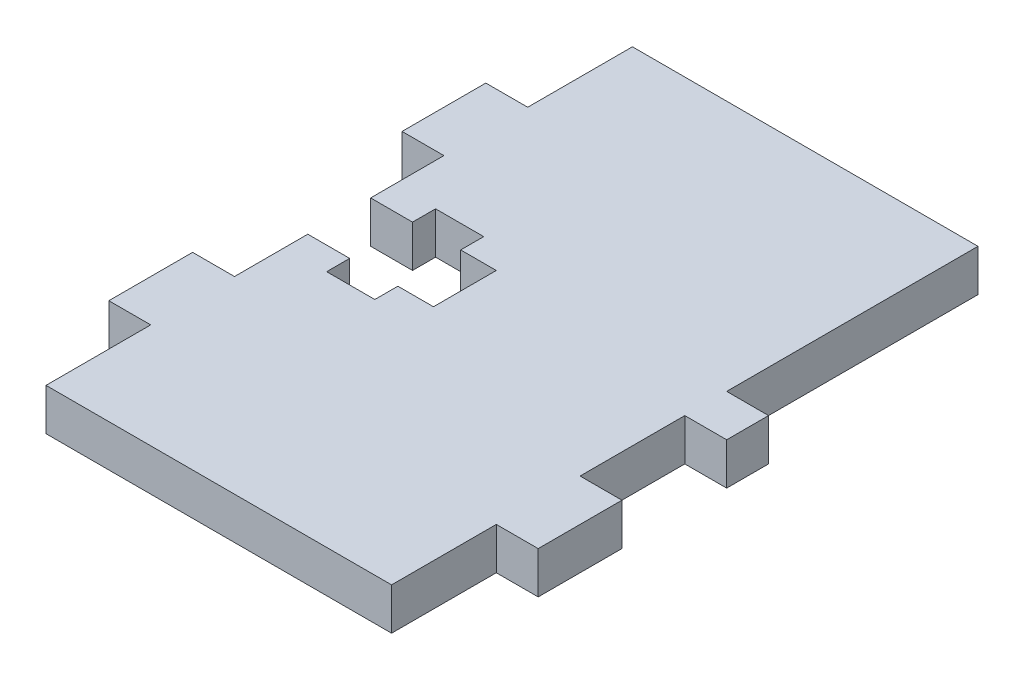
ISO-10303-21;
HEADER;
FILE_DESCRIPTION(('STEP AP214'),'2;1');
FILE_NAME('part.step','',(''),(''),'','','');
FILE_SCHEMA(('AUTOMOTIVE_DESIGN { 1 0 10303 214 1 1 1 1 }'));
ENDSEC;
DATA;
#1=APPLICATION_CONTEXT('core data for automotive mechanical design processes');
#2=APPLICATION_PROTOCOL_DEFINITION('international standard','automotive_design',2000,#1);
#3=PRODUCT_CONTEXT('',#1,'mechanical');
#4=PRODUCT('Part','Part','',(#3));
#5=PRODUCT_RELATED_PRODUCT_CATEGORY('part','',(#4));
#6=PRODUCT_DEFINITION_FORMATION('','',#4);
#7=PRODUCT_DEFINITION_CONTEXT('part definition',#1,'design');
#8=PRODUCT_DEFINITION('design','',#6,#7);
#9=PRODUCT_DEFINITION_SHAPE('','',#8);
#10=(LENGTH_UNIT() NAMED_UNIT(*) SI_UNIT(.MILLI.,.METRE.));
#11=(NAMED_UNIT(*) PLANE_ANGLE_UNIT() SI_UNIT($,.RADIAN.));
#12=(NAMED_UNIT(*) SI_UNIT($,.STERADIAN.) SOLID_ANGLE_UNIT());
#13=UNCERTAINTY_MEASURE_WITH_UNIT(LENGTH_MEASURE(1.E-05),#10,'distance_accuracy_value','');
#14=(GEOMETRIC_REPRESENTATION_CONTEXT(3) GLOBAL_UNCERTAINTY_ASSIGNED_CONTEXT((#13)) GLOBAL_UNIT_ASSIGNED_CONTEXT((#10,
#11,#12)) REPRESENTATION_CONTEXT('',''));
#15=CARTESIAN_POINT('',(0.,0.,0.));
#16=DIRECTION('',(0.,0.,1.));
#17=DIRECTION('',(1.,0.,0.));
#18=AXIS2_PLACEMENT_3D('',#15,#16,#17);
#19=CARTESIAN_POINT('',(0.,2.,0.));
#20=DIRECTION('',(1.,0.,0.));
#21=DIRECTION('',(0.,0.,-1.));
#22=AXIS2_PLACEMENT_3D('',#19,#20,#21);
#23=PLANE('',#22);
#24=DIRECTION('',(0.,0.,1.));
#25=VECTOR('',#24,1.);
#26=CARTESIAN_POINT('',(0.,0.,0.));
#27=LINE('',#26,#25);
#28=CARTESIAN_POINT('',(0.,0.,-5.));
#29=VERTEX_POINT('',#28);
#30=CARTESIAN_POINT('',(0.,0.,0.));
#31=VERTEX_POINT('',#30);
#32=EDGE_CURVE('E273',#29,#31,#27,.T.);
#33=ORIENTED_EDGE('',*,*,#32,.T.);
#34=DIRECTION('',(0.,-1.,0.));
#35=VECTOR('',#34,1.);
#36=CARTESIAN_POINT('',(0.,2.,0.));
#37=LINE('',#36,#35);
#38=CARTESIAN_POINT('',(0.,2.,0.));
#39=VERTEX_POINT('',#38);
#40=EDGE_CURVE('E11',#39,#31,#37,.T.);
#41=ORIENTED_EDGE('',*,*,#40,.F.);
#42=DIRECTION('',(0.,0.,1.));
#43=VECTOR('',#42,1.);
#44=CARTESIAN_POINT('',(0.,2.,0.));
#45=LINE('',#44,#43);
#46=CARTESIAN_POINT('',(0.,2.,-5.));
#47=VERTEX_POINT('',#46);
#48=EDGE_CURVE('E335',#47,#39,#45,.T.);
#49=ORIENTED_EDGE('',*,*,#48,.F.);
#50=DIRECTION('',(0.,-1.,0.));
#51=VECTOR('',#50,1.);
#52=CARTESIAN_POINT('',(0.,2.,-5.));
#53=LINE('',#52,#51);
#54=EDGE_CURVE('E269',#47,#29,#53,.T.);
#55=ORIENTED_EDGE('',*,*,#54,.T.);
#56=EDGE_LOOP('',(#33,#41,#49,#55));
#57=FACE_BOUND('',#56,.T.);
#58=ADVANCED_FACE('F33',(#57),#23,.F.);
#59=CARTESIAN_POINT('',(0.,2.,0.));
#60=DIRECTION('',(0.,0.,-1.));
#61=DIRECTION('',(-1.,0.,0.));
#62=AXIS2_PLACEMENT_3D('',#59,#60,#61);
#63=PLANE('',#62);
#64=DIRECTION('',(1.,0.,0.));
#65=VECTOR('',#64,1.);
#66=CARTESIAN_POINT('',(0.,0.,0.));
#67=LINE('',#66,#65);
#68=CARTESIAN_POINT('',(16.5,0.,0.));
#69=VERTEX_POINT('',#68);
#70=EDGE_CURVE('E276',#31,#69,#67,.T.);
#71=ORIENTED_EDGE('',*,*,#70,.T.);
#72=DIRECTION('',(0.,-1.,0.));
#73=VECTOR('',#72,1.);
#74=CARTESIAN_POINT('',(16.5,2.,0.));
#75=LINE('',#74,#73);
#76=CARTESIAN_POINT('',(16.5,2.,0.));
#77=VERTEX_POINT('',#76);
#78=EDGE_CURVE('E41',#77,#69,#75,.T.);
#79=ORIENTED_EDGE('',*,*,#78,.F.);
#80=DIRECTION('',(1.,0.,0.));
#81=VECTOR('',#80,1.);
#82=CARTESIAN_POINT('',(0.,2.,0.));
#83=LINE('',#82,#81);
#84=EDGE_CURVE('E164',#39,#77,#83,.T.);
#85=ORIENTED_EDGE('',*,*,#84,.F.);
#86=ORIENTED_EDGE('',*,*,#40,.T.);
#87=EDGE_LOOP('',(#71,#79,#85,#86));
#88=FACE_BOUND('',#87,.T.);
#89=ADVANCED_FACE('F513',(#88),#63,.F.);
#90=CARTESIAN_POINT('',(16.5,2.,0.));
#91=DIRECTION('',(-1.,0.,0.));
#92=DIRECTION('',(0.,0.,1.));
#93=AXIS2_PLACEMENT_3D('',#90,#91,#92);
#94=PLANE('',#93);
#95=DIRECTION('',(0.,0.,-1.));
#96=VECTOR('',#95,1.);
#97=CARTESIAN_POINT('',(16.5,0.,0.));
#98=LINE('',#97,#96);
#99=CARTESIAN_POINT('',(16.5,0.,-5.));
#100=VERTEX_POINT('',#99);
#101=EDGE_CURVE('E278',#69,#100,#98,.T.);
#102=ORIENTED_EDGE('',*,*,#101,.T.);
#103=DIRECTION('',(0.,-1.,0.));
#104=VECTOR('',#103,1.);
#105=CARTESIAN_POINT('',(16.5,2.,-5.));
#106=LINE('',#105,#104);
#107=CARTESIAN_POINT('',(16.5,2.,-5.));
#108=VERTEX_POINT('',#107);
#109=EDGE_CURVE('E414',#108,#100,#106,.T.);
#110=ORIENTED_EDGE('',*,*,#109,.F.);
#111=DIRECTION('',(0.,0.,-1.));
#112=VECTOR('',#111,1.);
#113=CARTESIAN_POINT('',(16.5,2.,0.));
#114=LINE('',#113,#112);
#115=EDGE_CURVE('E422',#77,#108,#114,.T.);
#116=ORIENTED_EDGE('',*,*,#115,.F.);
#117=ORIENTED_EDGE('',*,*,#78,.T.);
#118=EDGE_LOOP('',(#102,#110,#116,#117));
#119=FACE_BOUND('',#118,.T.);
#120=ADVANCED_FACE('F420',(#119),#94,.F.);
#121=CARTESIAN_POINT('',(16.5,2.,-5.));
#122=DIRECTION('',(0.,0.,-1.));
#123=DIRECTION('',(-1.,0.,0.));
#124=AXIS2_PLACEMENT_3D('',#121,#122,#123);
#125=PLANE('',#124);
#126=DIRECTION('',(1.,0.,0.));
#127=VECTOR('',#126,1.);
#128=CARTESIAN_POINT('',(16.5,0.,-5.));
#129=LINE('',#128,#127);
#130=CARTESIAN_POINT('',(18.5,0.,-5.));
#131=VERTEX_POINT('',#130);
#132=EDGE_CURVE('E280',#100,#131,#129,.T.);
#133=ORIENTED_EDGE('',*,*,#132,.T.);
#134=DIRECTION('',(0.,-1.,0.));
#135=VECTOR('',#134,1.);
#136=CARTESIAN_POINT('',(18.5,2.,-5.));
#137=LINE('',#136,#135);
#138=CARTESIAN_POINT('',(18.5,2.,-5.));
#139=VERTEX_POINT('',#138);
#140=EDGE_CURVE('E411',#139,#131,#137,.T.);
#141=ORIENTED_EDGE('',*,*,#140,.F.);
#142=DIRECTION('',(1.,0.,0.));
#143=VECTOR('',#142,1.);
#144=CARTESIAN_POINT('',(16.5,2.,-5.));
#145=LINE('',#144,#143);
#146=EDGE_CURVE('E440',#108,#139,#145,.T.);
#147=ORIENTED_EDGE('',*,*,#146,.F.);
#148=ORIENTED_EDGE('',*,*,#109,.T.);
#149=EDGE_LOOP('',(#133,#141,#147,#148));
#150=FACE_BOUND('',#149,.T.);
#151=ADVANCED_FACE('F431',(#150),#125,.F.);
#152=CARTESIAN_POINT('',(18.5,2.,-5.));
#153=DIRECTION('',(-1.,0.,0.));
#154=DIRECTION('',(0.,0.,1.));
#155=AXIS2_PLACEMENT_3D('',#152,#153,#154);
#156=PLANE('',#155);
#157=DIRECTION('',(0.,0.,-1.));
#158=VECTOR('',#157,1.);
#159=CARTESIAN_POINT('',(18.5,0.,-5.));
#160=LINE('',#159,#158);
#161=CARTESIAN_POINT('',(18.5,0.,-9.));
#162=VERTEX_POINT('',#161);
#163=EDGE_CURVE('E282',#131,#162,#160,.T.);
#164=ORIENTED_EDGE('',*,*,#163,.T.);
#165=DIRECTION('',(0.,-1.,0.));
#166=VECTOR('',#165,1.);
#167=CARTESIAN_POINT('',(18.5,2.,-9.));
#168=LINE('',#167,#166);
#169=CARTESIAN_POINT('',(18.5,2.,-9.));
#170=VERTEX_POINT('',#169);
#171=EDGE_CURVE('E408',#170,#162,#168,.T.);
#172=ORIENTED_EDGE('',*,*,#171,.F.);
#173=DIRECTION('',(0.,0.,-1.));
#174=VECTOR('',#173,1.);
#175=CARTESIAN_POINT('',(18.5,2.,-5.));
#176=LINE('',#175,#174);
#177=EDGE_CURVE('E437',#139,#170,#176,.T.);
#178=ORIENTED_EDGE('',*,*,#177,.F.);
#179=ORIENTED_EDGE('',*,*,#140,.T.);
#180=EDGE_LOOP('',(#164,#172,#178,#179));
#181=FACE_BOUND('',#180,.T.);
#182=ADVANCED_FACE('F435',(#181),#156,.F.);
#183=CARTESIAN_POINT('',(16.5,2.,-9.));
#184=DIRECTION('',(0.,0.,1.));
#185=DIRECTION('',(1.,0.,0.));
#186=AXIS2_PLACEMENT_3D('',#183,#184,#185);
#187=PLANE('',#186);
#188=DIRECTION('',(-1.,0.,0.));
#189=VECTOR('',#188,1.);
#190=CARTESIAN_POINT('',(16.5,0.,-9.));
#191=LINE('',#190,#189);
#192=CARTESIAN_POINT('',(16.5,0.,-9.));
#193=VERTEX_POINT('',#192);
#194=EDGE_CURVE('E284',#162,#193,#191,.T.);
#195=ORIENTED_EDGE('',*,*,#194,.T.);
#196=DIRECTION('',(0.,-1.,0.));
#197=VECTOR('',#196,1.);
#198=CARTESIAN_POINT('',(16.5,2.,-9.));
#199=LINE('',#198,#197);
#200=CARTESIAN_POINT('',(16.5,2.,-9.));
#201=VERTEX_POINT('',#200);
#202=EDGE_CURVE('E405',#201,#193,#199,.T.);
#203=ORIENTED_EDGE('',*,*,#202,.F.);
#204=DIRECTION('',(-1.,0.,0.));
#205=VECTOR('',#204,1.);
#206=CARTESIAN_POINT('',(16.5,2.,-9.));
#207=LINE('',#206,#205);
#208=EDGE_CURVE('E439',#170,#201,#207,.T.);
#209=ORIENTED_EDGE('',*,*,#208,.F.);
#210=ORIENTED_EDGE('',*,*,#171,.T.);
#211=EDGE_LOOP('',(#195,#203,#209,#210));
#212=FACE_BOUND('',#211,.T.);
#213=ADVANCED_FACE('F526',(#212),#187,.F.);
#214=CARTESIAN_POINT('',(16.5,2.,-9.));
#215=DIRECTION('',(-1.,0.,0.));
#216=DIRECTION('',(0.,0.,1.));
#217=AXIS2_PLACEMENT_3D('',#214,#215,#216);
#218=PLANE('',#217);
#219=DIRECTION('',(0.,0.,-1.));
#220=VECTOR('',#219,1.);
#221=CARTESIAN_POINT('',(16.5,0.,-9.));
#222=LINE('',#221,#220);
#223=CARTESIAN_POINT('',(16.5,0.,-14.));
#224=VERTEX_POINT('',#223);
#225=EDGE_CURVE('E286',#193,#224,#222,.T.);
#226=ORIENTED_EDGE('',*,*,#225,.T.);
#227=DIRECTION('',(0.,-1.,0.));
#228=VECTOR('',#227,1.);
#229=CARTESIAN_POINT('',(16.5,2.,-14.));
#230=LINE('',#229,#228);
#231=CARTESIAN_POINT('',(16.5,2.,-14.));
#232=VERTEX_POINT('',#231);
#233=EDGE_CURVE('E402',#232,#224,#230,.T.);
#234=ORIENTED_EDGE('',*,*,#233,.F.);
#235=DIRECTION('',(0.,0.,-1.));
#236=VECTOR('',#235,1.);
#237=CARTESIAN_POINT('',(16.5,2.,-9.));
#238=LINE('',#237,#236);
#239=EDGE_CURVE('E442',#201,#232,#238,.T.);
#240=ORIENTED_EDGE('',*,*,#239,.F.);
#241=ORIENTED_EDGE('',*,*,#202,.T.);
#242=EDGE_LOOP('',(#226,#234,#240,#241));
#243=FACE_BOUND('',#242,.T.);
#244=ADVANCED_FACE('F529',(#243),#218,.F.);
#245=CARTESIAN_POINT('',(16.5,2.,-14.));
#246=DIRECTION('',(0.,0.,-1.));
#247=DIRECTION('',(-1.,0.,0.));
#248=AXIS2_PLACEMENT_3D('',#245,#246,#247);
#249=PLANE('',#248);
#250=DIRECTION('',(1.,0.,0.));
#251=VECTOR('',#250,1.);
#252=CARTESIAN_POINT('',(16.5,0.,-14.));
#253=LINE('',#252,#251);
#254=CARTESIAN_POINT('',(18.5,0.,-14.));
#255=VERTEX_POINT('',#254);
#256=EDGE_CURVE('E288',#224,#255,#253,.T.);
#257=ORIENTED_EDGE('',*,*,#256,.T.);
#258=DIRECTION('',(0.,-1.,0.));
#259=VECTOR('',#258,1.);
#260=CARTESIAN_POINT('',(18.5,2.,-14.));
#261=LINE('',#260,#259);
#262=CARTESIAN_POINT('',(18.5,2.,-14.));
#263=VERTEX_POINT('',#262);
#264=EDGE_CURVE('E399',#263,#255,#261,.T.);
#265=ORIENTED_EDGE('',*,*,#264,.F.);
#266=DIRECTION('',(1.,0.,0.));
#267=VECTOR('',#266,1.);
#268=CARTESIAN_POINT('',(16.5,2.,-14.));
#269=LINE('',#268,#267);
#270=EDGE_CURVE('E448',#232,#263,#269,.T.);
#271=ORIENTED_EDGE('',*,*,#270,.F.);
#272=ORIENTED_EDGE('',*,*,#233,.T.);
#273=EDGE_LOOP('',(#257,#265,#271,#272));
#274=FACE_BOUND('',#273,.T.);
#275=ADVANCED_FACE('F533',(#274),#249,.F.);
#276=CARTESIAN_POINT('',(18.5,2.,-14.));
#277=DIRECTION('',(-1.,0.,0.));
#278=DIRECTION('',(0.,0.,1.));
#279=AXIS2_PLACEMENT_3D('',#276,#277,#278);
#280=PLANE('',#279);
#281=DIRECTION('',(0.,0.,-1.));
#282=VECTOR('',#281,1.);
#283=CARTESIAN_POINT('',(18.5,0.,-14.));
#284=LINE('',#283,#282);
#285=CARTESIAN_POINT('',(18.5,0.,-16.));
#286=VERTEX_POINT('',#285);
#287=EDGE_CURVE('E290',#255,#286,#284,.T.);
#288=ORIENTED_EDGE('',*,*,#287,.T.);
#289=DIRECTION('',(0.,-1.,0.));
#290=VECTOR('',#289,1.);
#291=CARTESIAN_POINT('',(18.5,2.,-16.));
#292=LINE('',#291,#290);
#293=CARTESIAN_POINT('',(18.5,2.,-16.));
#294=VERTEX_POINT('',#293);
#295=EDGE_CURVE('E396',#294,#286,#292,.T.);
#296=ORIENTED_EDGE('',*,*,#295,.F.);
#297=DIRECTION('',(0.,0.,-1.));
#298=VECTOR('',#297,1.);
#299=CARTESIAN_POINT('',(18.5,2.,-14.));
#300=LINE('',#299,#298);
#301=EDGE_CURVE('E450',#263,#294,#300,.T.);
#302=ORIENTED_EDGE('',*,*,#301,.F.);
#303=ORIENTED_EDGE('',*,*,#264,.T.);
#304=EDGE_LOOP('',(#288,#296,#302,#303));
#305=FACE_BOUND('',#304,.T.);
#306=ADVANCED_FACE('F537',(#305),#280,.F.);
#307=CARTESIAN_POINT('',(16.5,2.,-16.));
#308=DIRECTION('',(0.,0.,1.));
#309=DIRECTION('',(1.,0.,0.));
#310=AXIS2_PLACEMENT_3D('',#307,#308,#309);
#311=PLANE('',#310);
#312=DIRECTION('',(-1.,0.,0.));
#313=VECTOR('',#312,1.);
#314=CARTESIAN_POINT('',(16.5,0.,-16.));
#315=LINE('',#314,#313);
#316=CARTESIAN_POINT('',(16.5,0.,-16.));
#317=VERTEX_POINT('',#316);
#318=EDGE_CURVE('E292',#286,#317,#315,.T.);
#319=ORIENTED_EDGE('',*,*,#318,.T.);
#320=DIRECTION('',(0.,-1.,0.));
#321=VECTOR('',#320,1.);
#322=CARTESIAN_POINT('',(16.5,2.,-16.));
#323=LINE('',#322,#321);
#324=CARTESIAN_POINT('',(16.5,2.,-16.));
#325=VERTEX_POINT('',#324);
#326=EDGE_CURVE('E393',#325,#317,#323,.T.);
#327=ORIENTED_EDGE('',*,*,#326,.F.);
#328=DIRECTION('',(-1.,0.,0.));
#329=VECTOR('',#328,1.);
#330=CARTESIAN_POINT('',(16.5,2.,-16.));
#331=LINE('',#330,#329);
#332=EDGE_CURVE('E452',#294,#325,#331,.T.);
#333=ORIENTED_EDGE('',*,*,#332,.F.);
#334=ORIENTED_EDGE('',*,*,#295,.T.);
#335=EDGE_LOOP('',(#319,#327,#333,#334));
#336=FACE_BOUND('',#335,.T.);
#337=ADVANCED_FACE('F541',(#336),#311,.F.);
#338=CARTESIAN_POINT('',(16.5,2.,-16.));
#339=DIRECTION('',(-1.,0.,0.));
#340=DIRECTION('',(0.,0.,1.));
#341=AXIS2_PLACEMENT_3D('',#338,#339,#340);
#342=PLANE('',#341);
#343=DIRECTION('',(0.,0.,-1.));
#344=VECTOR('',#343,1.);
#345=CARTESIAN_POINT('',(16.5,0.,-16.));
#346=LINE('',#345,#344);
#347=CARTESIAN_POINT('',(16.5,0.,-28.));
#348=VERTEX_POINT('',#347);
#349=EDGE_CURVE('E294',#317,#348,#346,.T.);
#350=ORIENTED_EDGE('',*,*,#349,.T.);
#351=DIRECTION('',(0.,-1.,0.));
#352=VECTOR('',#351,1.);
#353=CARTESIAN_POINT('',(16.5,2.,-28.));
#354=LINE('',#353,#352);
#355=CARTESIAN_POINT('',(16.5,2.,-28.));
#356=VERTEX_POINT('',#355);
#357=EDGE_CURVE('E390',#356,#348,#354,.T.);
#358=ORIENTED_EDGE('',*,*,#357,.F.);
#359=DIRECTION('',(0.,0.,-1.));
#360=VECTOR('',#359,1.);
#361=CARTESIAN_POINT('',(16.5,2.,-16.));
#362=LINE('',#361,#360);
#363=EDGE_CURVE('E454',#325,#356,#362,.T.);
#364=ORIENTED_EDGE('',*,*,#363,.F.);
#365=ORIENTED_EDGE('',*,*,#326,.T.);
#366=EDGE_LOOP('',(#350,#358,#364,#365));
#367=FACE_BOUND('',#366,.T.);
#368=ADVANCED_FACE('F545',(#367),#342,.F.);
#369=CARTESIAN_POINT('',(0.,2.,-28.));
#370=DIRECTION('',(0.,0.,1.));
#371=DIRECTION('',(1.,0.,0.));
#372=AXIS2_PLACEMENT_3D('',#369,#370,#371);
#373=PLANE('',#372);
#374=DIRECTION('',(-1.,0.,0.));
#375=VECTOR('',#374,1.);
#376=CARTESIAN_POINT('',(0.,0.,-28.));
#377=LINE('',#376,#375);
#378=CARTESIAN_POINT('',(0.,0.,-28.));
#379=VERTEX_POINT('',#378);
#380=EDGE_CURVE('E296',#348,#379,#377,.T.);
#381=ORIENTED_EDGE('',*,*,#380,.T.);
#382=DIRECTION('',(0.,-1.,0.));
#383=VECTOR('',#382,1.);
#384=CARTESIAN_POINT('',(0.,2.,-28.));
#385=LINE('',#384,#383);
#386=CARTESIAN_POINT('',(0.,2.,-28.));
#387=VERTEX_POINT('',#386);
#388=EDGE_CURVE('E387',#387,#379,#385,.T.);
#389=ORIENTED_EDGE('',*,*,#388,.F.);
#390=DIRECTION('',(-1.,0.,0.));
#391=VECTOR('',#390,1.);
#392=CARTESIAN_POINT('',(0.,2.,-28.));
#393=LINE('',#392,#391);
#394=EDGE_CURVE('E456',#356,#387,#393,.T.);
#395=ORIENTED_EDGE('',*,*,#394,.F.);
#396=ORIENTED_EDGE('',*,*,#357,.T.);
#397=EDGE_LOOP('',(#381,#389,#395,#396));
#398=FACE_BOUND('',#397,.T.);
#399=ADVANCED_FACE('F549',(#398),#373,.F.);
#400=CARTESIAN_POINT('',(0.,2.,-23.));
#401=DIRECTION('',(1.,0.,0.));
#402=DIRECTION('',(0.,0.,-1.));
#403=AXIS2_PLACEMENT_3D('',#400,#401,#402);
#404=PLANE('',#403);
#405=DIRECTION('',(0.,0.,1.));
#406=VECTOR('',#405,1.);
#407=CARTESIAN_POINT('',(0.,0.,-23.));
#408=LINE('',#407,#406);
#409=CARTESIAN_POINT('',(0.,0.,-23.));
#410=VERTEX_POINT('',#409);
#411=EDGE_CURVE('E298',#379,#410,#408,.T.);
#412=ORIENTED_EDGE('',*,*,#411,.T.);
#413=DIRECTION('',(0.,-1.,0.));
#414=VECTOR('',#413,1.);
#415=CARTESIAN_POINT('',(0.,2.,-23.));
#416=LINE('',#415,#414);
#417=CARTESIAN_POINT('',(0.,2.,-23.));
#418=VERTEX_POINT('',#417);
#419=EDGE_CURVE('E384',#418,#410,#416,.T.);
#420=ORIENTED_EDGE('',*,*,#419,.F.);
#421=DIRECTION('',(0.,0.,1.));
#422=VECTOR('',#421,1.);
#423=CARTESIAN_POINT('',(0.,2.,-23.));
#424=LINE('',#423,#422);
#425=EDGE_CURVE('E458',#387,#418,#424,.T.);
#426=ORIENTED_EDGE('',*,*,#425,.F.);
#427=ORIENTED_EDGE('',*,*,#388,.T.);
#428=EDGE_LOOP('',(#412,#420,#426,#427));
#429=FACE_BOUND('',#428,.T.);
#430=ADVANCED_FACE('F553',(#429),#404,.F.);
#431=CARTESIAN_POINT('',(0.,2.,-23.));
#432=DIRECTION('',(0.,0.,1.));
#433=DIRECTION('',(1.,0.,0.));
#434=AXIS2_PLACEMENT_3D('',#431,#432,#433);
#435=PLANE('',#434);
#436=DIRECTION('',(-1.,0.,0.));
#437=VECTOR('',#436,1.);
#438=CARTESIAN_POINT('',(0.,0.,-23.));
#439=LINE('',#438,#437);
#440=CARTESIAN_POINT('',(-2.,0.,-23.));
#441=VERTEX_POINT('',#440);
#442=EDGE_CURVE('E300',#410,#441,#439,.T.);
#443=ORIENTED_EDGE('',*,*,#442,.T.);
#444=DIRECTION('',(0.,-1.,0.));
#445=VECTOR('',#444,1.);
#446=CARTESIAN_POINT('',(-2.,2.,-23.));
#447=LINE('',#446,#445);
#448=CARTESIAN_POINT('',(-2.,2.,-23.));
#449=VERTEX_POINT('',#448);
#450=EDGE_CURVE('E381',#449,#441,#447,.T.);
#451=ORIENTED_EDGE('',*,*,#450,.F.);
#452=DIRECTION('',(-1.,0.,0.));
#453=VECTOR('',#452,1.);
#454=CARTESIAN_POINT('',(0.,2.,-23.));
#455=LINE('',#454,#453);
#456=EDGE_CURVE('E460',#418,#449,#455,.T.);
#457=ORIENTED_EDGE('',*,*,#456,.F.);
#458=ORIENTED_EDGE('',*,*,#419,.T.);
#459=EDGE_LOOP('',(#443,#451,#457,#458));
#460=FACE_BOUND('',#459,.T.);
#461=ADVANCED_FACE('F557',(#460),#435,.F.);
#462=CARTESIAN_POINT('',(-2.,2.,-23.));
#463=DIRECTION('',(1.,0.,0.));
#464=DIRECTION('',(0.,0.,-1.));
#465=AXIS2_PLACEMENT_3D('',#462,#463,#464);
#466=PLANE('',#465);
#467=DIRECTION('',(0.,0.,1.));
#468=VECTOR('',#467,1.);
#469=CARTESIAN_POINT('',(-2.,0.,-23.));
#470=LINE('',#469,#468);
#471=CARTESIAN_POINT('',(-2.,0.,-19.));
#472=VERTEX_POINT('',#471);
#473=EDGE_CURVE('E302',#441,#472,#470,.T.);
#474=ORIENTED_EDGE('',*,*,#473,.T.);
#475=DIRECTION('',(0.,-1.,0.));
#476=VECTOR('',#475,1.);
#477=CARTESIAN_POINT('',(-2.,2.,-19.));
#478=LINE('',#477,#476);
#479=CARTESIAN_POINT('',(-2.,2.,-19.));
#480=VERTEX_POINT('',#479);
#481=EDGE_CURVE('E378',#480,#472,#478,.T.);
#482=ORIENTED_EDGE('',*,*,#481,.F.);
#483=DIRECTION('',(0.,0.,1.));
#484=VECTOR('',#483,1.);
#485=CARTESIAN_POINT('',(-2.,2.,-23.));
#486=LINE('',#485,#484);
#487=EDGE_CURVE('E462',#449,#480,#486,.T.);
#488=ORIENTED_EDGE('',*,*,#487,.F.);
#489=ORIENTED_EDGE('',*,*,#450,.T.);
#490=EDGE_LOOP('',(#474,#482,#488,#489));
#491=FACE_BOUND('',#490,.T.);
#492=ADVANCED_FACE('F561',(#491),#466,.F.);
#493=CARTESIAN_POINT('',(0.,2.,-19.));
#494=DIRECTION('',(0.,0.,-1.));
#495=DIRECTION('',(-1.,0.,0.));
#496=AXIS2_PLACEMENT_3D('',#493,#494,#495);
#497=PLANE('',#496);
#498=DIRECTION('',(1.,0.,0.));
#499=VECTOR('',#498,1.);
#500=CARTESIAN_POINT('',(0.,0.,-19.));
#501=LINE('',#500,#499);
#502=CARTESIAN_POINT('',(0.,0.,-19.));
#503=VERTEX_POINT('',#502);
#504=EDGE_CURVE('E304',#472,#503,#501,.T.);
#505=ORIENTED_EDGE('',*,*,#504,.T.);
#506=DIRECTION('',(0.,-1.,0.));
#507=VECTOR('',#506,1.);
#508=CARTESIAN_POINT('',(0.,2.,-19.));
#509=LINE('',#508,#507);
#510=CARTESIAN_POINT('',(0.,2.,-19.));
#511=VERTEX_POINT('',#510);
#512=EDGE_CURVE('E375',#511,#503,#509,.T.);
#513=ORIENTED_EDGE('',*,*,#512,.F.);
#514=DIRECTION('',(1.,0.,0.));
#515=VECTOR('',#514,1.);
#516=CARTESIAN_POINT('',(0.,2.,-19.));
#517=LINE('',#516,#515);
#518=EDGE_CURVE('E464',#480,#511,#517,.T.);
#519=ORIENTED_EDGE('',*,*,#518,.F.);
#520=ORIENTED_EDGE('',*,*,#481,.T.);
#521=EDGE_LOOP('',(#505,#513,#519,#520));
#522=FACE_BOUND('',#521,.T.);
#523=ADVANCED_FACE('F565',(#522),#497,.F.);
#524=CARTESIAN_POINT('',(0.,2.,-15.5));
#525=DIRECTION('',(1.,0.,0.));
#526=DIRECTION('',(0.,0.,-1.));
#527=AXIS2_PLACEMENT_3D('',#524,#525,#526);
#528=PLANE('',#527);
#529=DIRECTION('',(0.,0.,1.));
#530=VECTOR('',#529,1.);
#531=CARTESIAN_POINT('',(0.,0.,-15.5));
#532=LINE('',#531,#530);
#533=CARTESIAN_POINT('',(0.,0.,-15.5));
#534=VERTEX_POINT('',#533);
#535=EDGE_CURVE('E306',#503,#534,#532,.T.);
#536=ORIENTED_EDGE('',*,*,#535,.T.);
#537=DIRECTION('',(0.,-1.,0.));
#538=VECTOR('',#537,1.);
#539=CARTESIAN_POINT('',(0.,2.,-15.5));
#540=LINE('',#539,#538);
#541=CARTESIAN_POINT('',(0.,2.,-15.5));
#542=VERTEX_POINT('',#541);
#543=EDGE_CURVE('E372',#542,#534,#540,.T.);
#544=ORIENTED_EDGE('',*,*,#543,.F.);
#545=DIRECTION('',(0.,0.,1.));
#546=VECTOR('',#545,1.);
#547=CARTESIAN_POINT('',(0.,2.,-15.5));
#548=LINE('',#547,#546);
#549=EDGE_CURVE('E466',#511,#542,#548,.T.);
#550=ORIENTED_EDGE('',*,*,#549,.F.);
#551=ORIENTED_EDGE('',*,*,#512,.T.);
#552=EDGE_LOOP('',(#536,#544,#550,#551));
#553=FACE_BOUND('',#552,.T.);
#554=ADVANCED_FACE('F569',(#553),#528,.F.);
#555=CARTESIAN_POINT('',(2.,2.,-15.5));
#556=DIRECTION('',(0.,0.,-1.));
#557=DIRECTION('',(-1.,0.,0.));
#558=AXIS2_PLACEMENT_3D('',#555,#556,#557);
#559=PLANE('',#558);
#560=DIRECTION('',(1.,0.,0.));
#561=VECTOR('',#560,1.);
#562=CARTESIAN_POINT('',(2.,0.,-15.5));
#563=LINE('',#562,#561);
#564=CARTESIAN_POINT('',(2.,0.,-15.5));
#565=VERTEX_POINT('',#564);
#566=EDGE_CURVE('E308',#534,#565,#563,.T.);
#567=ORIENTED_EDGE('',*,*,#566,.T.);
#568=DIRECTION('',(0.,-1.,0.));
#569=VECTOR('',#568,1.);
#570=CARTESIAN_POINT('',(2.,2.,-15.5));
#571=LINE('',#570,#569);
#572=CARTESIAN_POINT('',(2.,2.,-15.5));
#573=VERTEX_POINT('',#572);
#574=EDGE_CURVE('E369',#573,#565,#571,.T.);
#575=ORIENTED_EDGE('',*,*,#574,.F.);
#576=DIRECTION('',(1.,0.,0.));
#577=VECTOR('',#576,1.);
#578=CARTESIAN_POINT('',(2.,2.,-15.5));
#579=LINE('',#578,#577);
#580=EDGE_CURVE('E468',#542,#573,#579,.T.);
#581=ORIENTED_EDGE('',*,*,#580,.F.);
#582=ORIENTED_EDGE('',*,*,#543,.T.);
#583=EDGE_LOOP('',(#567,#575,#581,#582));
#584=FACE_BOUND('',#583,.T.);
#585=ADVANCED_FACE('F573',(#584),#559,.F.);
#586=CARTESIAN_POINT('',(2.,2.,-15.5));
#587=DIRECTION('',(-1.,0.,0.));
#588=DIRECTION('',(0.,0.,1.));
#589=AXIS2_PLACEMENT_3D('',#586,#587,#588);
#590=PLANE('',#589);
#591=DIRECTION('',(0.,0.,-1.));
#592=VECTOR('',#591,1.);
#593=CARTESIAN_POINT('',(2.,0.,-15.5));
#594=LINE('',#593,#592);
#595=CARTESIAN_POINT('',(2.,0.,-16.6));
#596=VERTEX_POINT('',#595);
#597=EDGE_CURVE('E310',#565,#596,#594,.T.);
#598=ORIENTED_EDGE('',*,*,#597,.T.);
#599=DIRECTION('',(0.,-1.,0.));
#600=VECTOR('',#599,1.);
#601=CARTESIAN_POINT('',(2.,2.,-16.6));
#602=LINE('',#601,#600);
#603=CARTESIAN_POINT('',(2.,2.,-16.6));
#604=VERTEX_POINT('',#603);
#605=EDGE_CURVE('E366',#604,#596,#602,.T.);
#606=ORIENTED_EDGE('',*,*,#605,.F.);
#607=DIRECTION('',(0.,0.,-1.));
#608=VECTOR('',#607,1.);
#609=CARTESIAN_POINT('',(2.,2.,-15.5));
#610=LINE('',#609,#608);
#611=EDGE_CURVE('E470',#573,#604,#610,.T.);
#612=ORIENTED_EDGE('',*,*,#611,.F.);
#613=ORIENTED_EDGE('',*,*,#574,.T.);
#614=EDGE_LOOP('',(#598,#606,#612,#613));
#615=FACE_BOUND('',#614,.T.);
#616=ADVANCED_FACE('F577',(#615),#590,.F.);
#617=CARTESIAN_POINT('',(2.,2.,-16.6));
#618=DIRECTION('',(0.,0.,-1.));
#619=DIRECTION('',(-1.,0.,0.));
#620=AXIS2_PLACEMENT_3D('',#617,#618,#619);
#621=PLANE('',#620);
#622=DIRECTION('',(1.,0.,0.));
#623=VECTOR('',#622,1.);
#624=CARTESIAN_POINT('',(2.,0.,-16.6));
#625=LINE('',#624,#623);
#626=CARTESIAN_POINT('',(4.3,0.,-16.6));
#627=VERTEX_POINT('',#626);
#628=EDGE_CURVE('E312',#596,#627,#625,.T.);
#629=ORIENTED_EDGE('',*,*,#628,.T.);
#630=DIRECTION('',(0.,-1.,0.));
#631=VECTOR('',#630,1.);
#632=CARTESIAN_POINT('',(4.3,2.,-16.6));
#633=LINE('',#632,#631);
#634=CARTESIAN_POINT('',(4.3,2.,-16.6));
#635=VERTEX_POINT('',#634);
#636=EDGE_CURVE('E363',#635,#627,#633,.T.);
#637=ORIENTED_EDGE('',*,*,#636,.F.);
#638=DIRECTION('',(1.,0.,0.));
#639=VECTOR('',#638,1.);
#640=CARTESIAN_POINT('',(2.,2.,-16.6));
#641=LINE('',#640,#639);
#642=EDGE_CURVE('E472',#604,#635,#641,.T.);
#643=ORIENTED_EDGE('',*,*,#642,.F.);
#644=ORIENTED_EDGE('',*,*,#605,.T.);
#645=EDGE_LOOP('',(#629,#637,#643,#644));
#646=FACE_BOUND('',#645,.T.);
#647=ADVANCED_FACE('F581',(#646),#621,.F.);
#648=CARTESIAN_POINT('',(4.3,2.,-15.5));
#649=DIRECTION('',(1.,0.,0.));
#650=DIRECTION('',(0.,0.,-1.));
#651=AXIS2_PLACEMENT_3D('',#648,#649,#650);
#652=PLANE('',#651);
#653=DIRECTION('',(0.,0.,1.));
#654=VECTOR('',#653,1.);
#655=CARTESIAN_POINT('',(4.3,0.,-15.5));
#656=LINE('',#655,#654);
#657=CARTESIAN_POINT('',(4.3,0.,-15.5));
#658=VERTEX_POINT('',#657);
#659=EDGE_CURVE('E314',#627,#658,#656,.T.);
#660=ORIENTED_EDGE('',*,*,#659,.T.);
#661=DIRECTION('',(0.,-1.,0.));
#662=VECTOR('',#661,1.);
#663=CARTESIAN_POINT('',(4.3,2.,-15.5));
#664=LINE('',#663,#662);
#665=CARTESIAN_POINT('',(4.3,2.,-15.5));
#666=VERTEX_POINT('',#665);
#667=EDGE_CURVE('E360',#666,#658,#664,.T.);
#668=ORIENTED_EDGE('',*,*,#667,.F.);
#669=DIRECTION('',(0.,0.,1.));
#670=VECTOR('',#669,1.);
#671=CARTESIAN_POINT('',(4.3,2.,-15.5));
#672=LINE('',#671,#670);
#673=EDGE_CURVE('E474',#635,#666,#672,.T.);
#674=ORIENTED_EDGE('',*,*,#673,.F.);
#675=ORIENTED_EDGE('',*,*,#636,.T.);
#676=EDGE_LOOP('',(#660,#668,#674,#675));
#677=FACE_BOUND('',#676,.T.);
#678=ADVANCED_FACE('F585',(#677),#652,.F.);
#679=CARTESIAN_POINT('',(6.,2.,-15.5));
#680=DIRECTION('',(0.,0.,-1.));
#681=DIRECTION('',(-1.,0.,0.));
#682=AXIS2_PLACEMENT_3D('',#679,#680,#681);
#683=PLANE('',#682);
#684=DIRECTION('',(1.,0.,0.));
#685=VECTOR('',#684,1.);
#686=CARTESIAN_POINT('',(6.,0.,-15.5));
#687=LINE('',#686,#685);
#688=CARTESIAN_POINT('',(6.,0.,-15.5));
#689=VERTEX_POINT('',#688);
#690=EDGE_CURVE('E316',#658,#689,#687,.T.);
#691=ORIENTED_EDGE('',*,*,#690,.T.);
#692=DIRECTION('',(0.,-1.,0.));
#693=VECTOR('',#692,1.);
#694=CARTESIAN_POINT('',(6.,2.,-15.5));
#695=LINE('',#694,#693);
#696=CARTESIAN_POINT('',(6.,2.,-15.5));
#697=VERTEX_POINT('',#696);
#698=EDGE_CURVE('E357',#697,#689,#695,.T.);
#699=ORIENTED_EDGE('',*,*,#698,.F.);
#700=DIRECTION('',(1.,0.,0.));
#701=VECTOR('',#700,1.);
#702=CARTESIAN_POINT('',(6.,2.,-15.5));
#703=LINE('',#702,#701);
#704=EDGE_CURVE('E476',#666,#697,#703,.T.);
#705=ORIENTED_EDGE('',*,*,#704,.F.);
#706=ORIENTED_EDGE('',*,*,#667,.T.);
#707=EDGE_LOOP('',(#691,#699,#705,#706));
#708=FACE_BOUND('',#707,.T.);
#709=ADVANCED_FACE('F589',(#708),#683,.F.);
#710=CARTESIAN_POINT('',(6.,2.,-12.5));
#711=DIRECTION('',(1.,0.,0.));
#712=DIRECTION('',(0.,0.,-1.));
#713=AXIS2_PLACEMENT_3D('',#710,#711,#712);
#714=PLANE('',#713);
#715=DIRECTION('',(0.,0.,1.));
#716=VECTOR('',#715,1.);
#717=CARTESIAN_POINT('',(6.,0.,-12.5));
#718=LINE('',#717,#716);
#719=CARTESIAN_POINT('',(6.,0.,-12.5));
#720=VERTEX_POINT('',#719);
#721=EDGE_CURVE('E318',#689,#720,#718,.T.);
#722=ORIENTED_EDGE('',*,*,#721,.T.);
#723=DIRECTION('',(0.,-1.,0.));
#724=VECTOR('',#723,1.);
#725=CARTESIAN_POINT('',(6.,2.,-12.5));
#726=LINE('',#725,#724);
#727=CARTESIAN_POINT('',(6.,2.,-12.5));
#728=VERTEX_POINT('',#727);
#729=EDGE_CURVE('E354',#728,#720,#726,.T.);
#730=ORIENTED_EDGE('',*,*,#729,.F.);
#731=DIRECTION('',(0.,0.,1.));
#732=VECTOR('',#731,1.);
#733=CARTESIAN_POINT('',(6.,2.,-12.5));
#734=LINE('',#733,#732);
#735=EDGE_CURVE('E478',#697,#728,#734,.T.);
#736=ORIENTED_EDGE('',*,*,#735,.F.);
#737=ORIENTED_EDGE('',*,*,#698,.T.);
#738=EDGE_LOOP('',(#722,#730,#736,#737));
#739=FACE_BOUND('',#738,.T.);
#740=ADVANCED_FACE('F593',(#739),#714,.F.);
#741=CARTESIAN_POINT('',(6.,2.,-12.5));
#742=DIRECTION('',(0.,0.,1.));
#743=DIRECTION('',(1.,0.,0.));
#744=AXIS2_PLACEMENT_3D('',#741,#742,#743);
#745=PLANE('',#744);
#746=DIRECTION('',(-1.,0.,0.));
#747=VECTOR('',#746,1.);
#748=CARTESIAN_POINT('',(6.,0.,-12.5));
#749=LINE('',#748,#747);
#750=CARTESIAN_POINT('',(4.3,0.,-12.5));
#751=VERTEX_POINT('',#750);
#752=EDGE_CURVE('E320',#720,#751,#749,.T.);
#753=ORIENTED_EDGE('',*,*,#752,.T.);
#754=DIRECTION('',(0.,-1.,0.));
#755=VECTOR('',#754,1.);
#756=CARTESIAN_POINT('',(4.3,2.,-12.5));
#757=LINE('',#756,#755);
#758=CARTESIAN_POINT('',(4.3,2.,-12.5));
#759=VERTEX_POINT('',#758);
#760=EDGE_CURVE('E351',#759,#751,#757,.T.);
#761=ORIENTED_EDGE('',*,*,#760,.F.);
#762=DIRECTION('',(-1.,0.,0.));
#763=VECTOR('',#762,1.);
#764=CARTESIAN_POINT('',(6.,2.,-12.5));
#765=LINE('',#764,#763);
#766=EDGE_CURVE('E480',#728,#759,#765,.T.);
#767=ORIENTED_EDGE('',*,*,#766,.F.);
#768=ORIENTED_EDGE('',*,*,#729,.T.);
#769=EDGE_LOOP('',(#753,#761,#767,#768));
#770=FACE_BOUND('',#769,.T.);
#771=ADVANCED_FACE('F597',(#770),#745,.F.);
#772=CARTESIAN_POINT('',(4.3,2.,-12.5));
#773=DIRECTION('',(1.,0.,0.));
#774=DIRECTION('',(0.,0.,-1.));
#775=AXIS2_PLACEMENT_3D('',#772,#773,#774);
#776=PLANE('',#775);
#777=DIRECTION('',(0.,0.,1.));
#778=VECTOR('',#777,1.);
#779=CARTESIAN_POINT('',(4.3,0.,-12.5));
#780=LINE('',#779,#778);
#781=CARTESIAN_POINT('',(4.3,0.,-11.4));
#782=VERTEX_POINT('',#781);
#783=EDGE_CURVE('E322',#751,#782,#780,.T.);
#784=ORIENTED_EDGE('',*,*,#783,.T.);
#785=DIRECTION('',(0.,-1.,0.));
#786=VECTOR('',#785,1.);
#787=CARTESIAN_POINT('',(4.3,2.,-11.4));
#788=LINE('',#787,#786);
#789=CARTESIAN_POINT('',(4.3,2.,-11.4));
#790=VERTEX_POINT('',#789);
#791=EDGE_CURVE('E348',#790,#782,#788,.T.);
#792=ORIENTED_EDGE('',*,*,#791,.F.);
#793=DIRECTION('',(0.,0.,1.));
#794=VECTOR('',#793,1.);
#795=CARTESIAN_POINT('',(4.3,2.,-12.5));
#796=LINE('',#795,#794);
#797=EDGE_CURVE('E482',#759,#790,#796,.T.);
#798=ORIENTED_EDGE('',*,*,#797,.F.);
#799=ORIENTED_EDGE('',*,*,#760,.T.);
#800=EDGE_LOOP('',(#784,#792,#798,#799));
#801=FACE_BOUND('',#800,.T.);
#802=ADVANCED_FACE('F601',(#801),#776,.F.);
#803=CARTESIAN_POINT('',(2.,2.,-11.4));
#804=DIRECTION('',(0.,0.,1.));
#805=DIRECTION('',(1.,0.,0.));
#806=AXIS2_PLACEMENT_3D('',#803,#804,#805);
#807=PLANE('',#806);
#808=DIRECTION('',(-1.,0.,0.));
#809=VECTOR('',#808,1.);
#810=CARTESIAN_POINT('',(2.,0.,-11.4));
#811=LINE('',#810,#809);
#812=CARTESIAN_POINT('',(2.,0.,-11.4));
#813=VERTEX_POINT('',#812);
#814=EDGE_CURVE('E324',#782,#813,#811,.T.);
#815=ORIENTED_EDGE('',*,*,#814,.T.);
#816=DIRECTION('',(0.,-1.,0.));
#817=VECTOR('',#816,1.);
#818=CARTESIAN_POINT('',(2.,2.,-11.4));
#819=LINE('',#818,#817);
#820=CARTESIAN_POINT('',(2.,2.,-11.4));
#821=VERTEX_POINT('',#820);
#822=EDGE_CURVE('E345',#821,#813,#819,.T.);
#823=ORIENTED_EDGE('',*,*,#822,.F.);
#824=DIRECTION('',(-1.,0.,0.));
#825=VECTOR('',#824,1.);
#826=CARTESIAN_POINT('',(2.,2.,-11.4));
#827=LINE('',#826,#825);
#828=EDGE_CURVE('E484',#790,#821,#827,.T.);
#829=ORIENTED_EDGE('',*,*,#828,.F.);
#830=ORIENTED_EDGE('',*,*,#791,.T.);
#831=EDGE_LOOP('',(#815,#823,#829,#830));
#832=FACE_BOUND('',#831,.T.);
#833=ADVANCED_FACE('F605',(#832),#807,.F.);
#834=CARTESIAN_POINT('',(2.,2.,-12.5));
#835=DIRECTION('',(-1.,0.,0.));
#836=DIRECTION('',(0.,0.,1.));
#837=AXIS2_PLACEMENT_3D('',#834,#835,#836);
#838=PLANE('',#837);
#839=DIRECTION('',(0.,0.,-1.));
#840=VECTOR('',#839,1.);
#841=CARTESIAN_POINT('',(2.,0.,-12.5));
#842=LINE('',#841,#840);
#843=CARTESIAN_POINT('',(2.,0.,-12.5));
#844=VERTEX_POINT('',#843);
#845=EDGE_CURVE('E326',#813,#844,#842,.T.);
#846=ORIENTED_EDGE('',*,*,#845,.T.);
#847=DIRECTION('',(0.,-1.,0.));
#848=VECTOR('',#847,1.);
#849=CARTESIAN_POINT('',(2.,2.,-12.5));
#850=LINE('',#849,#848);
#851=CARTESIAN_POINT('',(2.,2.,-12.5));
#852=VERTEX_POINT('',#851);
#853=EDGE_CURVE('E342',#852,#844,#850,.T.);
#854=ORIENTED_EDGE('',*,*,#853,.F.);
#855=DIRECTION('',(0.,0.,-1.));
#856=VECTOR('',#855,1.);
#857=CARTESIAN_POINT('',(2.,2.,-12.5));
#858=LINE('',#857,#856);
#859=EDGE_CURVE('E486',#821,#852,#858,.T.);
#860=ORIENTED_EDGE('',*,*,#859,.F.);
#861=ORIENTED_EDGE('',*,*,#822,.T.);
#862=EDGE_LOOP('',(#846,#854,#860,#861));
#863=FACE_BOUND('',#862,.T.);
#864=ADVANCED_FACE('F609',(#863),#838,.F.);
#865=CARTESIAN_POINT('',(2.,2.,-12.5));
#866=DIRECTION('',(0.,0.,1.));
#867=DIRECTION('',(1.,0.,0.));
#868=AXIS2_PLACEMENT_3D('',#865,#866,#867);
#869=PLANE('',#868);
#870=DIRECTION('',(-1.,0.,0.));
#871=VECTOR('',#870,1.);
#872=CARTESIAN_POINT('',(2.,0.,-12.5));
#873=LINE('',#872,#871);
#874=CARTESIAN_POINT('',(0.,0.,-12.5));
#875=VERTEX_POINT('',#874);
#876=EDGE_CURVE('E328',#844,#875,#873,.T.);
#877=ORIENTED_EDGE('',*,*,#876,.T.);
#878=DIRECTION('',(0.,-1.,0.));
#879=VECTOR('',#878,1.);
#880=CARTESIAN_POINT('',(0.,2.,-12.5));
#881=LINE('',#880,#879);
#882=CARTESIAN_POINT('',(0.,2.,-12.5));
#883=VERTEX_POINT('',#882);
#884=EDGE_CURVE('E339',#883,#875,#881,.T.);
#885=ORIENTED_EDGE('',*,*,#884,.F.);
#886=DIRECTION('',(-1.,0.,0.));
#887=VECTOR('',#886,1.);
#888=CARTESIAN_POINT('',(2.,2.,-12.5));
#889=LINE('',#888,#887);
#890=EDGE_CURVE('E488',#852,#883,#889,.T.);
#891=ORIENTED_EDGE('',*,*,#890,.F.);
#892=ORIENTED_EDGE('',*,*,#853,.T.);
#893=EDGE_LOOP('',(#877,#885,#891,#892));
#894=FACE_BOUND('',#893,.T.);
#895=ADVANCED_FACE('F494',(#894),#869,.F.);
#896=CARTESIAN_POINT('',(0.,2.,-9.));
#897=DIRECTION('',(1.,0.,0.));
#898=DIRECTION('',(0.,0.,-1.));
#899=AXIS2_PLACEMENT_3D('',#896,#897,#898);
#900=PLANE('',#899);
#901=DIRECTION('',(0.,0.,1.));
#902=VECTOR('',#901,1.);
#903=CARTESIAN_POINT('',(0.,0.,-9.));
#904=LINE('',#903,#902);
#905=CARTESIAN_POINT('',(0.,0.,-9.));
#906=VERTEX_POINT('',#905);
#907=EDGE_CURVE('E330',#875,#906,#904,.T.);
#908=ORIENTED_EDGE('',*,*,#907,.T.);
#909=DIRECTION('',(0.,-1.,0.));
#910=VECTOR('',#909,1.);
#911=CARTESIAN_POINT('',(0.,2.,-9.));
#912=LINE('',#911,#910);
#913=CARTESIAN_POINT('',(0.,2.,-9.));
#914=VERTEX_POINT('',#913);
#915=EDGE_CURVE('E264',#914,#906,#912,.T.);
#916=ORIENTED_EDGE('',*,*,#915,.F.);
#917=DIRECTION('',(0.,0.,1.));
#918=VECTOR('',#917,1.);
#919=CARTESIAN_POINT('',(0.,2.,-9.));
#920=LINE('',#919,#918);
#921=EDGE_CURVE('E255',#883,#914,#920,.T.);
#922=ORIENTED_EDGE('',*,*,#921,.F.);
#923=ORIENTED_EDGE('',*,*,#884,.T.);
#924=EDGE_LOOP('',(#908,#916,#922,#923));
#925=FACE_BOUND('',#924,.T.);
#926=ADVANCED_FACE('F498',(#925),#900,.F.);
#927=CARTESIAN_POINT('',(0.,2.,-9.));
#928=DIRECTION('',(0.,0.,1.));
#929=DIRECTION('',(1.,0.,0.));
#930=AXIS2_PLACEMENT_3D('',#927,#928,#929);
#931=PLANE('',#930);
#932=DIRECTION('',(-1.,0.,0.));
#933=VECTOR('',#932,1.);
#934=CARTESIAN_POINT('',(0.,0.,-9.));
#935=LINE('',#934,#933);
#936=CARTESIAN_POINT('',(-2.,0.,-9.));
#937=VERTEX_POINT('',#936);
#938=EDGE_CURVE('E263',#906,#937,#935,.T.);
#939=ORIENTED_EDGE('',*,*,#938,.T.);
#940=DIRECTION('',(0.,-1.,0.));
#941=VECTOR('',#940,1.);
#942=CARTESIAN_POINT('',(-2.,2.,-9.));
#943=LINE('',#942,#941);
#944=CARTESIAN_POINT('',(-2.,2.,-9.));
#945=VERTEX_POINT('',#944);
#946=EDGE_CURVE('E260',#945,#937,#943,.T.);
#947=ORIENTED_EDGE('',*,*,#946,.F.);
#948=DIRECTION('',(-1.,0.,0.));
#949=VECTOR('',#948,1.);
#950=CARTESIAN_POINT('',(0.,2.,-9.));
#951=LINE('',#950,#949);
#952=EDGE_CURVE('E249',#914,#945,#951,.T.);
#953=ORIENTED_EDGE('',*,*,#952,.F.);
#954=ORIENTED_EDGE('',*,*,#915,.T.);
#955=EDGE_LOOP('',(#939,#947,#953,#954));
#956=FACE_BOUND('',#955,.T.);
#957=ADVANCED_FACE('F261',(#956),#931,.F.);
#958=CARTESIAN_POINT('',(-2.,2.,-5.));
#959=DIRECTION('',(1.,0.,0.));
#960=DIRECTION('',(0.,0.,-1.));
#961=AXIS2_PLACEMENT_3D('',#958,#959,#960);
#962=PLANE('',#961);
#963=DIRECTION('',(0.,0.,1.));
#964=VECTOR('',#963,1.);
#965=CARTESIAN_POINT('',(-2.,0.,-5.));
#966=LINE('',#965,#964);
#967=CARTESIAN_POINT('',(-2.,0.,-5.));
#968=VERTEX_POINT('',#967);
#969=EDGE_CURVE('E150',#937,#968,#966,.T.);
#970=ORIENTED_EDGE('',*,*,#969,.T.);
#971=DIRECTION('',(0.,-1.,0.));
#972=VECTOR('',#971,1.);
#973=CARTESIAN_POINT('',(-2.,2.,-5.));
#974=LINE('',#973,#972);
#975=CARTESIAN_POINT('',(-2.,2.,-5.));
#976=VERTEX_POINT('',#975);
#977=EDGE_CURVE('E265',#976,#968,#974,.T.);
#978=ORIENTED_EDGE('',*,*,#977,.F.);
#979=DIRECTION('',(0.,0.,1.));
#980=VECTOR('',#979,1.);
#981=CARTESIAN_POINT('',(-2.,2.,-5.));
#982=LINE('',#981,#980);
#983=EDGE_CURVE('E253',#945,#976,#982,.T.);
#984=ORIENTED_EDGE('',*,*,#983,.F.);
#985=ORIENTED_EDGE('',*,*,#946,.T.);
#986=EDGE_LOOP('',(#970,#978,#984,#985));
#987=FACE_BOUND('',#986,.T.);
#988=ADVANCED_FACE('F267',(#987),#962,.F.);
#989=CARTESIAN_POINT('',(0.,2.,-5.));
#990=DIRECTION('',(0.,0.,-1.));
#991=DIRECTION('',(-1.,0.,0.));
#992=AXIS2_PLACEMENT_3D('',#989,#990,#991);
#993=PLANE('',#992);
#994=DIRECTION('',(1.,0.,0.));
#995=VECTOR('',#994,1.);
#996=CARTESIAN_POINT('',(0.,0.,-5.));
#997=LINE('',#996,#995);
#998=EDGE_CURVE('E156',#968,#29,#997,.T.);
#999=ORIENTED_EDGE('',*,*,#998,.T.);
#1000=ORIENTED_EDGE('',*,*,#54,.F.);
#1001=DIRECTION('',(1.,0.,0.));
#1002=VECTOR('',#1001,1.);
#1003=CARTESIAN_POINT('',(0.,2.,-5.));
#1004=LINE('',#1003,#1002);
#1005=EDGE_CURVE('E49',#976,#47,#1004,.T.);
#1006=ORIENTED_EDGE('',*,*,#1005,.F.);
#1007=ORIENTED_EDGE('',*,*,#977,.T.);
#1008=EDGE_LOOP('',(#999,#1000,#1006,#1007));
#1009=FACE_BOUND('',#1008,.T.);
#1010=ADVANCED_FACE('F502',(#1009),#993,.F.);
#1011=CARTESIAN_POINT('',(0.,2.,0.));
#1012=DIRECTION('',(0.,1.,0.));
#1013=DIRECTION('',(0.,0.,1.));
#1014=AXIS2_PLACEMENT_3D('',#1011,#1012,#1013);
#1015=PLANE('',#1014);
#1016=ORIENTED_EDGE('',*,*,#48,.T.);
#1017=ORIENTED_EDGE('',*,*,#84,.T.);
#1018=ORIENTED_EDGE('',*,*,#115,.T.);
#1019=ORIENTED_EDGE('',*,*,#146,.T.);
#1020=ORIENTED_EDGE('',*,*,#177,.T.);
#1021=ORIENTED_EDGE('',*,*,#208,.T.);
#1022=ORIENTED_EDGE('',*,*,#239,.T.);
#1023=ORIENTED_EDGE('',*,*,#270,.T.);
#1024=ORIENTED_EDGE('',*,*,#301,.T.);
#1025=ORIENTED_EDGE('',*,*,#332,.T.);
#1026=ORIENTED_EDGE('',*,*,#363,.T.);
#1027=ORIENTED_EDGE('',*,*,#394,.T.);
#1028=ORIENTED_EDGE('',*,*,#425,.T.);
#1029=ORIENTED_EDGE('',*,*,#456,.T.);
#1030=ORIENTED_EDGE('',*,*,#487,.T.);
#1031=ORIENTED_EDGE('',*,*,#518,.T.);
#1032=ORIENTED_EDGE('',*,*,#549,.T.);
#1033=ORIENTED_EDGE('',*,*,#580,.T.);
#1034=ORIENTED_EDGE('',*,*,#611,.T.);
#1035=ORIENTED_EDGE('',*,*,#642,.T.);
#1036=ORIENTED_EDGE('',*,*,#673,.T.);
#1037=ORIENTED_EDGE('',*,*,#704,.T.);
#1038=ORIENTED_EDGE('',*,*,#735,.T.);
#1039=ORIENTED_EDGE('',*,*,#766,.T.);
#1040=ORIENTED_EDGE('',*,*,#797,.T.);
#1041=ORIENTED_EDGE('',*,*,#828,.T.);
#1042=ORIENTED_EDGE('',*,*,#859,.T.);
#1043=ORIENTED_EDGE('',*,*,#890,.T.);
#1044=ORIENTED_EDGE('',*,*,#921,.T.);
#1045=ORIENTED_EDGE('',*,*,#952,.T.);
#1046=ORIENTED_EDGE('',*,*,#983,.T.);
#1047=ORIENTED_EDGE('',*,*,#1005,.T.);
#1048=EDGE_LOOP('',(#1016,#1017,#1018,#1019,#1020,#1021,#1022,#1023,#1024,#1025,#1026,#1027,
#1028,#1029,#1030,#1031,#1032,#1033,#1034,#1035,#1036,#1037,#1038,#1039,#1040,#1041,#1042,#1043,
#1044,#1045,#1046,#1047));
#1049=FACE_BOUND('',#1048,.T.);
#1050=ADVANCED_FACE('F251',(#1049),#1015,.T.);
#1051=CARTESIAN_POINT('',(0.,0.,0.));
#1052=DIRECTION('',(0.,1.,0.));
#1053=DIRECTION('',(0.,0.,1.));
#1054=AXIS2_PLACEMENT_3D('',#1051,#1052,#1053);
#1055=PLANE('',#1054);
#1056=ORIENTED_EDGE('',*,*,#32,.F.);
#1057=ORIENTED_EDGE('',*,*,#998,.F.);
#1058=ORIENTED_EDGE('',*,*,#969,.F.);
#1059=ORIENTED_EDGE('',*,*,#938,.F.);
#1060=ORIENTED_EDGE('',*,*,#907,.F.);
#1061=ORIENTED_EDGE('',*,*,#876,.F.);
#1062=ORIENTED_EDGE('',*,*,#845,.F.);
#1063=ORIENTED_EDGE('',*,*,#814,.F.);
#1064=ORIENTED_EDGE('',*,*,#783,.F.);
#1065=ORIENTED_EDGE('',*,*,#752,.F.);
#1066=ORIENTED_EDGE('',*,*,#721,.F.);
#1067=ORIENTED_EDGE('',*,*,#690,.F.);
#1068=ORIENTED_EDGE('',*,*,#659,.F.);
#1069=ORIENTED_EDGE('',*,*,#628,.F.);
#1070=ORIENTED_EDGE('',*,*,#597,.F.);
#1071=ORIENTED_EDGE('',*,*,#566,.F.);
#1072=ORIENTED_EDGE('',*,*,#535,.F.);
#1073=ORIENTED_EDGE('',*,*,#504,.F.);
#1074=ORIENTED_EDGE('',*,*,#473,.F.);
#1075=ORIENTED_EDGE('',*,*,#442,.F.);
#1076=ORIENTED_EDGE('',*,*,#411,.F.);
#1077=ORIENTED_EDGE('',*,*,#380,.F.);
#1078=ORIENTED_EDGE('',*,*,#349,.F.);
#1079=ORIENTED_EDGE('',*,*,#318,.F.);
#1080=ORIENTED_EDGE('',*,*,#287,.F.);
#1081=ORIENTED_EDGE('',*,*,#256,.F.);
#1082=ORIENTED_EDGE('',*,*,#225,.F.);
#1083=ORIENTED_EDGE('',*,*,#194,.F.);
#1084=ORIENTED_EDGE('',*,*,#163,.F.);
#1085=ORIENTED_EDGE('',*,*,#132,.F.);
#1086=ORIENTED_EDGE('',*,*,#101,.F.);
#1087=ORIENTED_EDGE('',*,*,#70,.F.);
#1088=EDGE_LOOP('',(#1056,#1057,#1058,#1059,#1060,#1061,#1062,#1063,#1064,#1065,#1066,#1067,
#1068,#1069,#1070,#1071,#1072,#1073,#1074,#1075,#1076,#1077,#1078,#1079,#1080,#1081,#1082,#1083,
#1084,#1085,#1086,#1087));
#1089=FACE_BOUND('',#1088,.T.);
#1090=ADVANCED_FACE('F426',(#1089),#1055,.F.);
#1091=CLOSED_SHELL('',(#58,#89,#120,#151,#182,#213,#244,#275,#306,#337,#368,#399,#430,#461,#492,
#523,#554,#585,#616,#647,#678,#709,#740,#771,#802,#833,#864,#895,#926,#957,#988,#1010,#1050,#1090));
#1092=MANIFOLD_SOLID_BREP('B2',#1091);
#1093=ADVANCED_BREP_SHAPE_REPRESENTATION('',(#18,#1092),#14);
#1094=SHAPE_DEFINITION_REPRESENTATION(#9,#1093);
ENDSEC;
END-ISO-10303-21;
